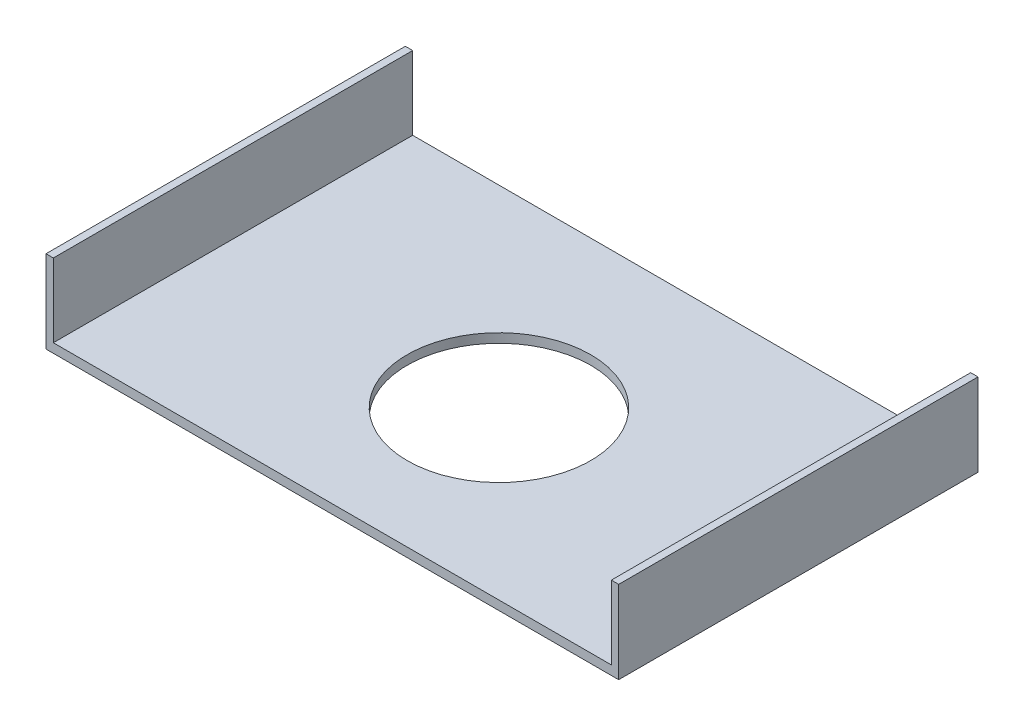
ISO-10303-21;
HEADER;
FILE_DESCRIPTION(('STEP AP214'),'2;1');
FILE_NAME('part.step','',(''),(''),'','','');
FILE_SCHEMA(('AUTOMOTIVE_DESIGN { 1 0 10303 214 1 1 1 1 }'));
ENDSEC;
DATA;
#1=APPLICATION_CONTEXT('core data for automotive mechanical design processes');
#2=APPLICATION_PROTOCOL_DEFINITION('international standard','automotive_design',2000,#1);
#3=PRODUCT_CONTEXT('',#1,'mechanical');
#4=PRODUCT('Part','Part','',(#3));
#5=PRODUCT_RELATED_PRODUCT_CATEGORY('part','',(#4));
#6=PRODUCT_DEFINITION_FORMATION('','',#4);
#7=PRODUCT_DEFINITION_CONTEXT('part definition',#1,'design');
#8=PRODUCT_DEFINITION('design','',#6,#7);
#9=PRODUCT_DEFINITION_SHAPE('','',#8);
#10=(LENGTH_UNIT() NAMED_UNIT(*) SI_UNIT(.MILLI.,.METRE.));
#11=(NAMED_UNIT(*) PLANE_ANGLE_UNIT() SI_UNIT($,.RADIAN.));
#12=(NAMED_UNIT(*) SI_UNIT($,.STERADIAN.) SOLID_ANGLE_UNIT());
#13=UNCERTAINTY_MEASURE_WITH_UNIT(LENGTH_MEASURE(1.E-05),#10,'distance_accuracy_value','');
#14=(GEOMETRIC_REPRESENTATION_CONTEXT(3) GLOBAL_UNCERTAINTY_ASSIGNED_CONTEXT((#13)) GLOBAL_UNIT_ASSIGNED_CONTEXT((#10,
#11,#12)) REPRESENTATION_CONTEXT('',''));
#15=CARTESIAN_POINT('',(0.,0.,0.));
#16=DIRECTION('',(0.,0.,1.));
#17=DIRECTION('',(1.,0.,0.));
#18=AXIS2_PLACEMENT_3D('',#15,#16,#17);
#19=CARTESIAN_POINT('',(0.,5.,0.));
#20=DIRECTION('',(0.,-1.,0.));
#21=DIRECTION('',(0.,0.,-1.));
#22=AXIS2_PLACEMENT_3D('',#19,#20,#21);
#23=PLANE('',#22);
#24=CARTESIAN_POINT('',(0.,5.,0.));
#25=DIRECTION('',(0.,1.,0.));
#26=DIRECTION('',(0.,0.,1.));
#27=AXIS2_PLACEMENT_3D('',#24,#25,#26);
#28=CIRCLE('',#27,50.);
#29=CARTESIAN_POINT('',(0.,5.,50.));
#30=VERTEX_POINT('',#29);
#31=EDGE_CURVE('E147',#30,#30,#28,.T.);
#32=ORIENTED_EDGE('',*,*,#31,.F.);
#33=EDGE_LOOP('',(#32));
#34=FACE_BOUND('',#33,.T.);
#35=DIRECTION('',(0.,0.,-1.));
#36=VECTOR('',#35,1.);
#37=CARTESIAN_POINT('',(-152.,5.,-115.));
#38=LINE('',#37,#36);
#39=CARTESIAN_POINT('',(-152.,5.,90.7654692666723));
#40=VERTEX_POINT('',#39);
#41=CARTESIAN_POINT('',(-152.,5.,-105.));
#42=VERTEX_POINT('',#41);
#43=EDGE_CURVE('E133',#40,#42,#38,.T.);
#44=ORIENTED_EDGE('',*,*,#43,.F.);
#45=DIRECTION('',(1.,0.,0.));
#46=VECTOR('',#45,1.);
#47=CARTESIAN_POINT('',(0.,5.,90.7654692666723));
#48=LINE('',#47,#46);
#49=CARTESIAN_POINT('',(152.,5.,90.7654692666723));
#50=VERTEX_POINT('',#49);
#51=EDGE_CURVE('E171',#40,#50,#48,.T.);
#52=ORIENTED_EDGE('',*,*,#51,.T.);
#53=DIRECTION('',(0.,0.,1.));
#54=VECTOR('',#53,1.);
#55=CARTESIAN_POINT('',(152.,5.,-115.));
#56=LINE('',#55,#54);
#57=CARTESIAN_POINT('',(152.,5.,-105.));
#58=VERTEX_POINT('',#57);
#59=EDGE_CURVE('E136',#58,#50,#56,.T.);
#60=ORIENTED_EDGE('',*,*,#59,.F.);
#61=DIRECTION('',(-1.,0.,0.));
#62=VECTOR('',#61,1.);
#63=CARTESIAN_POINT('',(0.,5.,-105.));
#64=LINE('',#63,#62);
#65=EDGE_CURVE('E155',#58,#42,#64,.T.);
#66=ORIENTED_EDGE('',*,*,#65,.T.);
#67=EDGE_LOOP('',(#44,#52,#60,#66));
#68=FACE_BOUND('',#67,.T.);
#69=ADVANCED_FACE('F43',(#34,#68),#23,.F.);
#70=CARTESIAN_POINT('',(156.,5.,115.));
#71=DIRECTION('',(-1.,0.,0.));
#72=DIRECTION('',(0.,0.,1.));
#73=AXIS2_PLACEMENT_3D('',#70,#71,#72);
#74=PLANE('',#73);
#75=DIRECTION('',(0.,0.,-1.));
#76=VECTOR('',#75,1.);
#77=CARTESIAN_POINT('',(156.,45.,-115.));
#78=LINE('',#77,#76);
#79=CARTESIAN_POINT('',(156.,45.,90.7654692666723));
#80=VERTEX_POINT('',#79);
#81=CARTESIAN_POINT('',(156.,45.,-105.));
#82=VERTEX_POINT('',#81);
#83=EDGE_CURVE('E139',#80,#82,#78,.T.);
#84=ORIENTED_EDGE('',*,*,#83,.F.);
#85=DIRECTION('',(0.,1.,0.));
#86=VECTOR('',#85,1.);
#87=CARTESIAN_POINT('',(156.,0.,90.7654692666723));
#88=LINE('',#87,#86);
#89=CARTESIAN_POINT('',(156.,0.,90.7654692666723));
#90=VERTEX_POINT('',#89);
#91=EDGE_CURVE('E58',#90,#80,#88,.T.);
#92=ORIENTED_EDGE('',*,*,#91,.F.);
#93=DIRECTION('',(0.,0.,-1.));
#94=VECTOR('',#93,1.);
#95=CARTESIAN_POINT('',(156.,0.,115.));
#96=LINE('',#95,#94);
#97=CARTESIAN_POINT('',(156.,0.,-105.));
#98=VERTEX_POINT('',#97);
#99=EDGE_CURVE('E124',#90,#98,#96,.T.);
#100=ORIENTED_EDGE('',*,*,#99,.T.);
#101=DIRECTION('',(0.,1.,0.));
#102=VECTOR('',#101,1.);
#103=CARTESIAN_POINT('',(156.,0.,-105.));
#104=LINE('',#103,#102);
#105=EDGE_CURVE('E159',#98,#82,#104,.T.);
#106=ORIENTED_EDGE('',*,*,#105,.T.);
#107=EDGE_LOOP('',(#84,#92,#100,#106));
#108=FACE_BOUND('',#107,.T.);
#109=ADVANCED_FACE('F45',(#108),#74,.F.);
#110=CARTESIAN_POINT('',(-156.,5.,115.));
#111=DIRECTION('',(1.,0.,0.));
#112=DIRECTION('',(0.,0.,-1.));
#113=AXIS2_PLACEMENT_3D('',#110,#111,#112);
#114=PLANE('',#113);
#115=DIRECTION('',(0.,0.,1.));
#116=VECTOR('',#115,1.);
#117=CARTESIAN_POINT('',(-156.,0.,115.));
#118=LINE('',#117,#116);
#119=CARTESIAN_POINT('',(-156.,0.,-105.));
#120=VERTEX_POINT('',#119);
#121=CARTESIAN_POINT('',(-156.,0.,90.7654692666723));
#122=VERTEX_POINT('',#121);
#123=EDGE_CURVE('E123',#120,#122,#118,.T.);
#124=ORIENTED_EDGE('',*,*,#123,.T.);
#125=DIRECTION('',(0.,1.,0.));
#126=VECTOR('',#125,1.);
#127=CARTESIAN_POINT('',(-156.,0.,90.7654692666723));
#128=LINE('',#127,#126);
#129=CARTESIAN_POINT('',(-156.,45.,90.7654692666723));
#130=VERTEX_POINT('',#129);
#131=EDGE_CURVE('E106',#122,#130,#128,.T.);
#132=ORIENTED_EDGE('',*,*,#131,.T.);
#133=DIRECTION('',(0.,0.,1.));
#134=VECTOR('',#133,1.);
#135=CARTESIAN_POINT('',(-156.,45.,-115.));
#136=LINE('',#135,#134);
#137=CARTESIAN_POINT('',(-156.,45.,-105.));
#138=VERTEX_POINT('',#137);
#139=EDGE_CURVE('E135',#138,#130,#136,.T.);
#140=ORIENTED_EDGE('',*,*,#139,.F.);
#141=DIRECTION('',(0.,1.,0.));
#142=VECTOR('',#141,1.);
#143=CARTESIAN_POINT('',(-156.,0.,-105.));
#144=LINE('',#143,#142);
#145=EDGE_CURVE('E128',#120,#138,#144,.T.);
#146=ORIENTED_EDGE('',*,*,#145,.F.);
#147=EDGE_LOOP('',(#124,#132,#140,#146));
#148=FACE_BOUND('',#147,.T.);
#149=ADVANCED_FACE('F127',(#148),#114,.F.);
#150=CARTESIAN_POINT('',(0.,0.,0.));
#151=DIRECTION('',(0.,-1.,0.));
#152=DIRECTION('',(0.,0.,-1.));
#153=AXIS2_PLACEMENT_3D('',#150,#151,#152);
#154=PLANE('',#153);
#155=DIRECTION('',(1.,0.,0.));
#156=VECTOR('',#155,1.);
#157=CARTESIAN_POINT('',(-156.,0.,90.7654692666723));
#158=LINE('',#157,#156);
#159=EDGE_CURVE('E109',#122,#90,#158,.T.);
#160=ORIENTED_EDGE('',*,*,#159,.F.);
#161=ORIENTED_EDGE('',*,*,#123,.F.);
#162=DIRECTION('',(1.,0.,0.));
#163=VECTOR('',#162,1.);
#164=CARTESIAN_POINT('',(-156.,0.,-105.));
#165=LINE('',#164,#163);
#166=EDGE_CURVE('E161',#120,#98,#165,.T.);
#167=ORIENTED_EDGE('',*,*,#166,.T.);
#168=ORIENTED_EDGE('',*,*,#99,.F.);
#169=EDGE_LOOP('',(#160,#161,#167,#168));
#170=FACE_BOUND('',#169,.T.);
#171=CARTESIAN_POINT('',(0.,0.,0.));
#172=DIRECTION('',(0.,1.,0.));
#173=DIRECTION('',(0.,0.,1.));
#174=AXIS2_PLACEMENT_3D('',#171,#172,#173);
#175=CIRCLE('',#174,50.);
#176=CARTESIAN_POINT('',(0.,0.,50.));
#177=VERTEX_POINT('',#176);
#178=EDGE_CURVE('E144',#177,#177,#175,.T.);
#179=ORIENTED_EDGE('',*,*,#178,.T.);
#180=EDGE_LOOP('',(#179));
#181=FACE_BOUND('',#180,.T.);
#182=ADVANCED_FACE('F120',(#170,#181),#154,.T.);
#183=CARTESIAN_POINT('',(-152.,45.,-115.));
#184=DIRECTION('',(-1.,0.,0.));
#185=DIRECTION('',(0.,0.,1.));
#186=AXIS2_PLACEMENT_3D('',#183,#184,#185);
#187=PLANE('',#186);
#188=DIRECTION('',(0.,0.,-1.));
#189=VECTOR('',#188,1.);
#190=CARTESIAN_POINT('',(-152.,45.,-115.));
#191=LINE('',#190,#189);
#192=CARTESIAN_POINT('',(-152.,45.,90.7654692666723));
#193=VERTEX_POINT('',#192);
#194=CARTESIAN_POINT('',(-152.,45.,-105.));
#195=VERTEX_POINT('',#194);
#196=EDGE_CURVE('E130',#193,#195,#191,.T.);
#197=ORIENTED_EDGE('',*,*,#196,.F.);
#198=DIRECTION('',(0.,-1.,0.));
#199=VECTOR('',#198,1.);
#200=CARTESIAN_POINT('',(-152.,45.,90.7654692666723));
#201=LINE('',#200,#199);
#202=EDGE_CURVE('E168',#193,#40,#201,.T.);
#203=ORIENTED_EDGE('',*,*,#202,.T.);
#204=ORIENTED_EDGE('',*,*,#43,.T.);
#205=DIRECTION('',(0.,1.,0.));
#206=VECTOR('',#205,1.);
#207=CARTESIAN_POINT('',(-152.,45.,-105.));
#208=LINE('',#207,#206);
#209=EDGE_CURVE('E150',#42,#195,#208,.T.);
#210=ORIENTED_EDGE('',*,*,#209,.T.);
#211=EDGE_LOOP('',(#197,#203,#204,#210));
#212=FACE_BOUND('',#211,.T.);
#213=ADVANCED_FACE('F183',(#212),#187,.F.);
#214=CARTESIAN_POINT('',(0.,45.,0.));
#215=DIRECTION('',(0.,1.,0.));
#216=DIRECTION('',(0.,0.,1.));
#217=AXIS2_PLACEMENT_3D('',#214,#215,#216);
#218=PLANE('',#217);
#219=DIRECTION('',(1.,0.,0.));
#220=VECTOR('',#219,1.);
#221=CARTESIAN_POINT('',(-156.,45.,90.7654692666723));
#222=LINE('',#221,#220);
#223=EDGE_CURVE('E111',#130,#193,#222,.T.);
#224=ORIENTED_EDGE('',*,*,#223,.T.);
#225=ORIENTED_EDGE('',*,*,#196,.T.);
#226=DIRECTION('',(1.,0.,0.));
#227=VECTOR('',#226,1.);
#228=CARTESIAN_POINT('',(-156.,45.,-105.));
#229=LINE('',#228,#227);
#230=EDGE_CURVE('E165',#138,#195,#229,.T.);
#231=ORIENTED_EDGE('',*,*,#230,.F.);
#232=ORIENTED_EDGE('',*,*,#139,.T.);
#233=EDGE_LOOP('',(#224,#225,#231,#232));
#234=FACE_BOUND('',#233,.T.);
#235=ADVANCED_FACE('F180',(#234),#218,.T.);
#236=CARTESIAN_POINT('',(152.,45.,-115.));
#237=DIRECTION('',(1.,0.,0.));
#238=DIRECTION('',(0.,0.,-1.));
#239=AXIS2_PLACEMENT_3D('',#236,#237,#238);
#240=PLANE('',#239);
#241=ORIENTED_EDGE('',*,*,#59,.T.);
#242=DIRECTION('',(0.,1.,0.));
#243=VECTOR('',#242,1.);
#244=CARTESIAN_POINT('',(152.,45.,90.7654692666723));
#245=LINE('',#244,#243);
#246=CARTESIAN_POINT('',(152.,45.,90.7654692666723));
#247=VERTEX_POINT('',#246);
#248=EDGE_CURVE('E174',#50,#247,#245,.T.);
#249=ORIENTED_EDGE('',*,*,#248,.T.);
#250=DIRECTION('',(0.,0.,1.));
#251=VECTOR('',#250,1.);
#252=CARTESIAN_POINT('',(152.,45.,-115.));
#253=LINE('',#252,#251);
#254=CARTESIAN_POINT('',(152.,45.,-105.));
#255=VERTEX_POINT('',#254);
#256=EDGE_CURVE('E141',#255,#247,#253,.T.);
#257=ORIENTED_EDGE('',*,*,#256,.F.);
#258=DIRECTION('',(0.,-1.,0.));
#259=VECTOR('',#258,1.);
#260=CARTESIAN_POINT('',(152.,45.,-105.));
#261=LINE('',#260,#259);
#262=EDGE_CURVE('E65',#255,#58,#261,.T.);
#263=ORIENTED_EDGE('',*,*,#262,.T.);
#264=EDGE_LOOP('',(#241,#249,#257,#263));
#265=FACE_BOUND('',#264,.T.);
#266=ADVANCED_FACE('F190',(#265),#240,.F.);
#267=CARTESIAN_POINT('',(0.,45.,0.));
#268=DIRECTION('',(0.,-1.,0.));
#269=DIRECTION('',(0.,0.,-1.));
#270=AXIS2_PLACEMENT_3D('',#267,#268,#269);
#271=PLANE('',#270);
#272=ORIENTED_EDGE('',*,*,#256,.T.);
#273=DIRECTION('',(1.,0.,0.));
#274=VECTOR('',#273,1.);
#275=CARTESIAN_POINT('',(0.,45.,90.7654692666723));
#276=LINE('',#275,#274);
#277=EDGE_CURVE('E11',#247,#80,#276,.T.);
#278=ORIENTED_EDGE('',*,*,#277,.T.);
#279=ORIENTED_EDGE('',*,*,#83,.T.);
#280=DIRECTION('',(-1.,0.,0.));
#281=VECTOR('',#280,1.);
#282=CARTESIAN_POINT('',(0.,45.,-105.));
#283=LINE('',#282,#281);
#284=EDGE_CURVE('E51',#82,#255,#283,.T.);
#285=ORIENTED_EDGE('',*,*,#284,.T.);
#286=EDGE_LOOP('',(#272,#278,#279,#285));
#287=FACE_BOUND('',#286,.T.);
#288=ADVANCED_FACE('F193',(#287),#271,.F.);
#289=CARTESIAN_POINT('',(0.,0.,0.));
#290=DIRECTION('',(0.,1.,0.));
#291=DIRECTION('',(0.,0.,1.));
#292=AXIS2_PLACEMENT_3D('',#289,#290,#291);
#293=CYLINDRICAL_SURFACE('',#292,50.);
#294=ORIENTED_EDGE('',*,*,#178,.F.);
#295=EDGE_LOOP('',(#294));
#296=FACE_BOUND('',#295,.T.);
#297=ORIENTED_EDGE('',*,*,#31,.T.);
#298=EDGE_LOOP('',(#297));
#299=FACE_BOUND('',#298,.T.);
#300=ADVANCED_FACE('F224',(#296,#299),#293,.F.);
#301=CARTESIAN_POINT('',(-156.,0.,-105.));
#302=DIRECTION('',(0.,0.,1.));
#303=DIRECTION('',(1.,0.,0.));
#304=AXIS2_PLACEMENT_3D('',#301,#302,#303);
#305=PLANE('',#304);
#306=ORIENTED_EDGE('',*,*,#65,.F.);
#307=ORIENTED_EDGE('',*,*,#262,.F.);
#308=ORIENTED_EDGE('',*,*,#284,.F.);
#309=ORIENTED_EDGE('',*,*,#105,.F.);
#310=ORIENTED_EDGE('',*,*,#166,.F.);
#311=ORIENTED_EDGE('',*,*,#145,.T.);
#312=ORIENTED_EDGE('',*,*,#230,.T.);
#313=ORIENTED_EDGE('',*,*,#209,.F.);
#314=EDGE_LOOP('',(#306,#307,#308,#309,#310,#311,#312,#313));
#315=FACE_BOUND('',#314,.T.);
#316=ADVANCED_FACE('F186',(#315),#305,.F.);
#317=CARTESIAN_POINT('',(-156.,0.,90.7654692666723));
#318=DIRECTION('',(0.,0.,-1.));
#319=DIRECTION('',(-1.,0.,0.));
#320=AXIS2_PLACEMENT_3D('',#317,#318,#319);
#321=PLANE('',#320);
#322=ORIENTED_EDGE('',*,*,#223,.F.);
#323=ORIENTED_EDGE('',*,*,#131,.F.);
#324=ORIENTED_EDGE('',*,*,#159,.T.);
#325=ORIENTED_EDGE('',*,*,#91,.T.);
#326=ORIENTED_EDGE('',*,*,#277,.F.);
#327=ORIENTED_EDGE('',*,*,#248,.F.);
#328=ORIENTED_EDGE('',*,*,#51,.F.);
#329=ORIENTED_EDGE('',*,*,#202,.F.);
#330=EDGE_LOOP('',(#322,#323,#324,#325,#326,#327,#328,#329));
#331=FACE_BOUND('',#330,.T.);
#332=ADVANCED_FACE('F108',(#331),#321,.F.);
#333=CLOSED_SHELL('',(#69,#109,#149,#182,#213,#235,#266,#288,#300,#316,#332));
#334=MANIFOLD_SOLID_BREP('B2',#333);
#335=ADVANCED_BREP_SHAPE_REPRESENTATION('',(#18,#334),#14);
#336=SHAPE_DEFINITION_REPRESENTATION(#9,#335);
ENDSEC;
END-ISO-10303-21;
